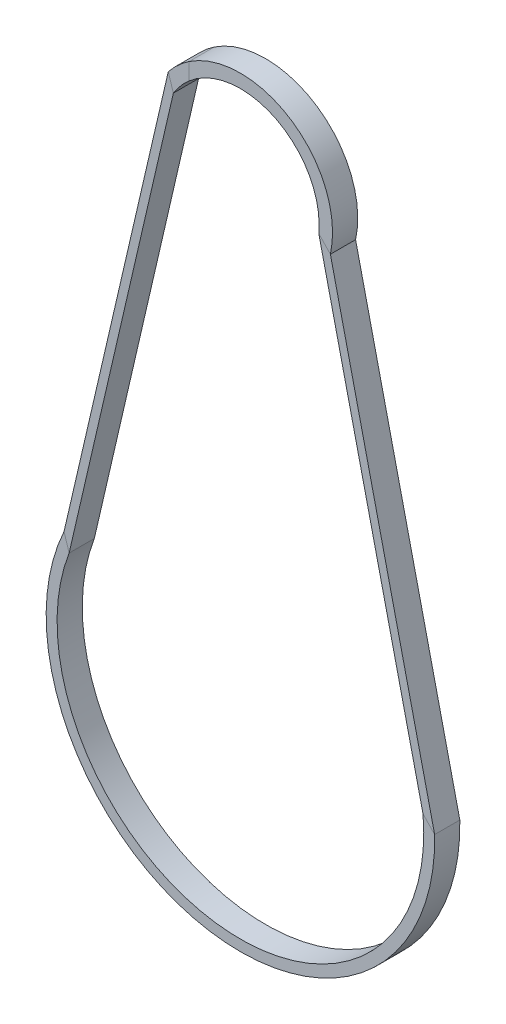
ISO-10303-21;
HEADER;
FILE_DESCRIPTION(('STEP AP214'),'2;1');
FILE_NAME('part.step','',(''),(''),'','','');
FILE_SCHEMA(('AUTOMOTIVE_DESIGN { 1 0 10303 214 1 1 1 1 }'));
ENDSEC;
DATA;
#1=APPLICATION_CONTEXT('core data for automotive mechanical design processes');
#2=APPLICATION_PROTOCOL_DEFINITION('international standard','automotive_design',2000,#1);
#3=PRODUCT_CONTEXT('',#1,'mechanical');
#4=PRODUCT('Part','Part','',(#3));
#5=PRODUCT_RELATED_PRODUCT_CATEGORY('part','',(#4));
#6=PRODUCT_DEFINITION_FORMATION('','',#4);
#7=PRODUCT_DEFINITION_CONTEXT('part definition',#1,'design');
#8=PRODUCT_DEFINITION('design','',#6,#7);
#9=PRODUCT_DEFINITION_SHAPE('','',#8);
#10=(LENGTH_UNIT() NAMED_UNIT(*) SI_UNIT(.MILLI.,.METRE.));
#11=(NAMED_UNIT(*) PLANE_ANGLE_UNIT() SI_UNIT($,.RADIAN.));
#12=(NAMED_UNIT(*) SI_UNIT($,.STERADIAN.) SOLID_ANGLE_UNIT());
#13=UNCERTAINTY_MEASURE_WITH_UNIT(LENGTH_MEASURE(1.E-05),#10,'distance_accuracy_value','');
#14=(GEOMETRIC_REPRESENTATION_CONTEXT(3) GLOBAL_UNCERTAINTY_ASSIGNED_CONTEXT((#13)) GLOBAL_UNIT_ASSIGNED_CONTEXT((#10,
#11,#12)) REPRESENTATION_CONTEXT('',''));
#15=CARTESIAN_POINT('',(0.,0.,0.));
#16=DIRECTION('',(0.,0.,1.));
#17=DIRECTION('',(1.,0.,0.));
#18=AXIS2_PLACEMENT_3D('',#15,#16,#17);
#19=CARTESIAN_POINT('',(3.46090677559141,6.54532965485075,0.));
#20=DIRECTION('',(0.,0.,-1.));
#21=DIRECTION('',(-1.,0.,0.));
#22=AXIS2_PLACEMENT_3D('',#19,#20,#21);
#23=CYLINDRICAL_SURFACE('',#22,9.37411083089852);
#24=CARTESIAN_POINT('',(3.46090677559141,6.54532965485075,0.));
#25=DIRECTION('',(0.,0.,-1.));
#26=DIRECTION('',(-0.851505632173699,0.52434545709529,0.));
#27=AXIS2_PLACEMENT_3D('',#24,#25,#26);
#28=CIRCLE('',#27,9.37411083089852);
#29=CARTESIAN_POINT('',(-4.52120139353916,11.4606020833402,0.));
#30=VERTEX_POINT('',#29);
#31=CARTESIAN_POINT('',(-2.65,13.6538296548507,0.));
#32=VERTEX_POINT('',#31);
#33=EDGE_CURVE('E11',#30,#32,#28,.T.);
#34=ORIENTED_EDGE('',*,*,#33,.F.);
#35=DIRECTION('',(0.,0.,-1.));
#36=VECTOR('',#35,1.);
#37=CARTESIAN_POINT('',(-4.52120139353916,11.4606020833402,0.));
#38=LINE('',#37,#36);
#39=CARTESIAN_POINT('',(-4.52120139353916,11.4606020833402,-3.));
#40=VERTEX_POINT('',#39);
#41=EDGE_CURVE('E36',#30,#40,#38,.T.);
#42=ORIENTED_EDGE('',*,*,#41,.T.);
#43=CARTESIAN_POINT('',(3.46090677559141,6.54532965485075,-3.));
#44=DIRECTION('',(0.,0.,-1.));
#45=DIRECTION('',(-0.851505632173699,0.52434545709529,0.));
#46=AXIS2_PLACEMENT_3D('',#43,#44,#45);
#47=CIRCLE('',#46,9.37411083089852);
#48=CARTESIAN_POINT('',(-2.65,13.6538296548507,-3.));
#49=VERTEX_POINT('',#48);
#50=EDGE_CURVE('E124',#40,#49,#47,.T.);
#51=ORIENTED_EDGE('',*,*,#50,.T.);
#52=DIRECTION('',(0.,0.,-1.));
#53=VECTOR('',#52,1.);
#54=CARTESIAN_POINT('',(-2.65,13.6538296548507,0.));
#55=LINE('',#54,#53);
#56=EDGE_CURVE('E127',#32,#49,#55,.T.);
#57=ORIENTED_EDGE('',*,*,#56,.F.);
#58=EDGE_LOOP('',(#34,#42,#51,#57));
#59=FACE_BOUND('',#58,.T.);
#60=ADVANCED_FACE('F33',(#59),#23,.F.);
#61=CARTESIAN_POINT('',(-4.52120139353916,11.4606020833401,0.));
#62=DIRECTION('',(0.,0.,1.));
#63=DIRECTION('',(1.,0.,0.));
#64=AXIS2_PLACEMENT_3D('',#61,#62,#63);
#65=PLANE('',#64);
#66=CARTESIAN_POINT('',(3.46090677559141,6.54532965485075,0.));
#67=DIRECTION('',(0.,0.,-1.));
#68=DIRECTION('',(-0.78314174114479,0.621843238506865,0.));
#69=AXIS2_PLACEMENT_3D('',#66,#67,#68);
#70=CIRCLE('',#69,10.9684982504429);
#71=CARTESIAN_POINT('',(-5.12898204200404,13.3660161284631,0.));
#72=VERTEX_POINT('',#71);
#73=CARTESIAN_POINT('',(-2.65,15.6538296548507,0.));
#74=VERTEX_POINT('',#73);
#75=EDGE_CURVE('E41',#72,#74,#70,.T.);
#76=ORIENTED_EDGE('',*,*,#75,.F.);
#77=DIRECTION('',(0.303890324232439,-0.95270702256145,0.));
#78=VECTOR('',#77,1.);
#79=CARTESIAN_POINT('',(-4.52120139353916,11.4606020833402,0.));
#80=LINE('',#79,#78);
#81=EDGE_CURVE('E214',#72,#30,#80,.T.);
#82=ORIENTED_EDGE('',*,*,#81,.T.);
#83=ORIENTED_EDGE('',*,*,#33,.T.);
#84=DIRECTION('',(0.,-1.,0.));
#85=VECTOR('',#84,1.);
#86=CARTESIAN_POINT('',(-2.65,13.6538296548507,0.));
#87=LINE('',#86,#85);
#88=EDGE_CURVE('E152',#74,#32,#87,.T.);
#89=ORIENTED_EDGE('',*,*,#88,.F.);
#90=EDGE_LOOP('',(#76,#82,#83,#89));
#91=FACE_BOUND('',#90,.T.);
#92=ADVANCED_FACE('F261',(#91),#65,.T.);
#93=CARTESIAN_POINT('',(3.46090677559141,6.54532965485075,0.));
#94=DIRECTION('',(0.,0.,-1.));
#95=DIRECTION('',(-1.,0.,0.));
#96=AXIS2_PLACEMENT_3D('',#93,#94,#95);
#97=CYLINDRICAL_SURFACE('',#96,10.9684982504429);
#98=CARTESIAN_POINT('',(3.46090677559141,6.54532965485075,-3.));
#99=DIRECTION('',(0.,0.,-1.));
#100=DIRECTION('',(-0.78314174114479,0.621843238506865,0.));
#101=AXIS2_PLACEMENT_3D('',#98,#99,#100);
#102=CIRCLE('',#101,10.9684982504429);
#103=CARTESIAN_POINT('',(-5.12898204200404,13.3660161284631,-3.));
#104=VERTEX_POINT('',#103);
#105=CARTESIAN_POINT('',(-2.65,15.6538296548507,-3.));
#106=VERTEX_POINT('',#105);
#107=EDGE_CURVE('E133',#104,#106,#102,.T.);
#108=ORIENTED_EDGE('',*,*,#107,.F.);
#109=DIRECTION('',(0.,0.,1.));
#110=VECTOR('',#109,1.);
#111=CARTESIAN_POINT('',(-5.12898204200404,13.3660161284631,0.));
#112=LINE('',#111,#110);
#113=EDGE_CURVE('E189',#104,#72,#112,.T.);
#114=ORIENTED_EDGE('',*,*,#113,.T.);
#115=ORIENTED_EDGE('',*,*,#75,.T.);
#116=DIRECTION('',(0.,0.,1.));
#117=VECTOR('',#116,1.);
#118=CARTESIAN_POINT('',(-2.65,15.6538296548507,0.));
#119=LINE('',#118,#117);
#120=EDGE_CURVE('E156',#106,#74,#119,.T.);
#121=ORIENTED_EDGE('',*,*,#120,.F.);
#122=EDGE_LOOP('',(#108,#114,#115,#121));
#123=FACE_BOUND('',#122,.T.);
#124=ADVANCED_FACE('F265',(#123),#97,.T.);
#125=CARTESIAN_POINT('',(-16.9317153945077,-42.1673736086449,0.));
#126=DIRECTION('',(0.974252384579708,-0.225460176396525,0.));
#127=DIRECTION('',(0.225460176396525,0.974252384579708,0.));
#128=AXIS2_PLACEMENT_3D('',#125,#126,#127);
#129=PLANE('',#128);
#130=ORIENTED_EDGE('',*,*,#41,.F.);
#131=DIRECTION('',(0.225460176396525,0.974252384579709,0.));
#132=VECTOR('',#131,1.);
#133=CARTESIAN_POINT('',(-16.9317153945077,-42.1673736086449,0.));
#134=LINE('',#133,#132);
#135=CARTESIAN_POINT('',(-16.9317153945077,-42.167373608645,0.));
#136=VERTEX_POINT('',#135);
#137=EDGE_CURVE('E228',#136,#30,#134,.T.);
#138=ORIENTED_EDGE('',*,*,#137,.F.);
#139=DIRECTION('',(0.,0.,-1.));
#140=VECTOR('',#139,1.);
#141=CARTESIAN_POINT('',(-16.9317153945077,-42.1673736086449,0.));
#142=LINE('',#141,#140);
#143=CARTESIAN_POINT('',(-16.9317153945077,-42.167373608645,-3.));
#144=VERTEX_POINT('',#143);
#145=EDGE_CURVE('E192',#136,#144,#142,.T.);
#146=ORIENTED_EDGE('',*,*,#145,.T.);
#147=DIRECTION('',(0.225460176396525,0.974252384579709,0.));
#148=VECTOR('',#147,1.);
#149=CARTESIAN_POINT('',(-16.9317153945077,-42.1673736086449,-3.));
#150=LINE('',#149,#148);
#151=EDGE_CURVE('E186',#144,#40,#150,.T.);
#152=ORIENTED_EDGE('',*,*,#151,.T.);
#153=EDGE_LOOP('',(#130,#138,#146,#152));
#154=FACE_BOUND('',#153,.T.);
#155=ADVANCED_FACE('F237',(#154),#129,.T.);
#156=CARTESIAN_POINT('',(-16.9317153945077,-42.1673736086449,0.));
#157=DIRECTION('',(0.,0.,1.));
#158=DIRECTION('',(1.,0.,0.));
#159=AXIS2_PLACEMENT_3D('',#156,#157,#158);
#160=PLANE('',#159);
#161=ORIENTED_EDGE('',*,*,#137,.T.);
#162=ORIENTED_EDGE('',*,*,#81,.F.);
#163=DIRECTION('',(0.225460176396525,0.974252384579709,0.));
#164=VECTOR('',#163,1.);
#165=CARTESIAN_POINT('',(-17.5394960429726,-40.261959563522,0.));
#166=LINE('',#165,#164);
#167=CARTESIAN_POINT('',(-17.5394960429726,-40.261959563522,0.));
#168=VERTEX_POINT('',#167);
#169=EDGE_CURVE('E211',#168,#72,#166,.T.);
#170=ORIENTED_EDGE('',*,*,#169,.F.);
#171=DIRECTION('',(0.30389032423244,-0.95270702256145,0.));
#172=VECTOR('',#171,1.);
#173=CARTESIAN_POINT('',(-16.9317153945077,-42.1673736086449,0.));
#174=LINE('',#173,#172);
#175=EDGE_CURVE('E207',#168,#136,#174,.T.);
#176=ORIENTED_EDGE('',*,*,#175,.T.);
#177=EDGE_LOOP('',(#161,#162,#170,#176));
#178=FACE_BOUND('',#177,.T.);
#179=ADVANCED_FACE('F274',(#178),#160,.T.);
#180=CARTESIAN_POINT('',(-17.5394960429726,-40.261959563522,0.));
#181=DIRECTION('',(-0.974252384579708,0.225460176396525,0.));
#182=DIRECTION('',(-0.225460176396525,-0.974252384579708,0.));
#183=AXIS2_PLACEMENT_3D('',#180,#181,#182);
#184=PLANE('',#183);
#185=ORIENTED_EDGE('',*,*,#169,.T.);
#186=ORIENTED_EDGE('',*,*,#113,.F.);
#187=DIRECTION('',(0.225460176396525,0.974252384579709,0.));
#188=VECTOR('',#187,1.);
#189=CARTESIAN_POINT('',(-17.5394960429726,-40.261959563522,-3.));
#190=LINE('',#189,#188);
#191=CARTESIAN_POINT('',(-17.5394960429726,-40.261959563522,-3.));
#192=VERTEX_POINT('',#191);
#193=EDGE_CURVE('E185',#192,#104,#190,.T.);
#194=ORIENTED_EDGE('',*,*,#193,.F.);
#195=DIRECTION('',(0.,0.,1.));
#196=VECTOR('',#195,1.);
#197=CARTESIAN_POINT('',(-17.5394960429726,-40.261959563522,0.));
#198=LINE('',#197,#196);
#199=EDGE_CURVE('E178',#192,#168,#198,.T.);
#200=ORIENTED_EDGE('',*,*,#199,.T.);
#201=EDGE_LOOP('',(#185,#186,#194,#200));
#202=FACE_BOUND('',#201,.T.);
#203=ADVANCED_FACE('F245',(#202),#184,.T.);
#204=CARTESIAN_POINT('',(-16.9317153945077,-42.1673736086449,-3.));
#205=DIRECTION('',(0.,0.,-1.));
#206=DIRECTION('',(-1.,0.,0.));
#207=AXIS2_PLACEMENT_3D('',#204,#205,#206);
#208=PLANE('',#207);
#209=ORIENTED_EDGE('',*,*,#193,.T.);
#210=DIRECTION('',(-0.303890324232439,0.95270702256145,0.));
#211=VECTOR('',#210,1.);
#212=CARTESIAN_POINT('',(-4.52120139353916,11.4606020833402,-3.));
#213=LINE('',#212,#211);
#214=EDGE_CURVE('E183',#40,#104,#213,.T.);
#215=ORIENTED_EDGE('',*,*,#214,.F.);
#216=ORIENTED_EDGE('',*,*,#151,.F.);
#217=DIRECTION('',(-0.30389032423244,0.95270702256145,0.));
#218=VECTOR('',#217,1.);
#219=CARTESIAN_POINT('',(-16.9317153945077,-42.1673736086449,-3.));
#220=LINE('',#219,#218);
#221=EDGE_CURVE('E175',#144,#192,#220,.T.);
#222=ORIENTED_EDGE('',*,*,#221,.T.);
#223=EDGE_LOOP('',(#209,#215,#216,#222));
#224=FACE_BOUND('',#223,.T.);
#225=ADVANCED_FACE('F242',(#224),#208,.T.);
#226=CARTESIAN_POINT('',(3.46090677559147,-49.9546704941614,0.));
#227=DIRECTION('',(0.,0.,-1.));
#228=DIRECTION('',(-1.,0.,0.));
#229=AXIS2_PLACEMENT_3D('',#226,#227,#228);
#230=CYLINDRICAL_SURFACE('',#229,21.8289035857415);
#231=ORIENTED_EDGE('',*,*,#145,.F.);
#232=CARTESIAN_POINT('',(3.46090677559147,-49.9546704941614,0.));
#233=DIRECTION('',(0.,0.,-1.));
#234=DIRECTION('',(0.995948048785206,0.0899304404578343,0.));
#235=AXIS2_PLACEMENT_3D('',#232,#233,#234);
#236=CIRCLE('',#235,21.8289035857415);
#237=CARTESIAN_POINT('',(25.2013607089311,-47.9915875799841,0.));
#238=VERTEX_POINT('',#237);
#239=EDGE_CURVE('E82',#238,#136,#236,.T.);
#240=ORIENTED_EDGE('',*,*,#239,.F.);
#241=DIRECTION('',(0.,0.,-1.));
#242=VECTOR('',#241,1.);
#243=CARTESIAN_POINT('',(25.2013607089311,-47.9915875799841,0.));
#244=LINE('',#243,#242);
#245=CARTESIAN_POINT('',(25.2013607089311,-47.9915875799841,-3.));
#246=VERTEX_POINT('',#245);
#247=EDGE_CURVE('E182',#238,#246,#244,.T.);
#248=ORIENTED_EDGE('',*,*,#247,.T.);
#249=CARTESIAN_POINT('',(3.46090677559147,-49.9546704941614,-3.));
#250=DIRECTION('',(0.,0.,-1.));
#251=DIRECTION('',(0.995948048785206,0.0899304404578343,0.));
#252=AXIS2_PLACEMENT_3D('',#249,#250,#251);
#253=CIRCLE('',#252,21.8289035857415);
#254=EDGE_CURVE('E180',#246,#144,#253,.T.);
#255=ORIENTED_EDGE('',*,*,#254,.T.);
#256=EDGE_LOOP('',(#231,#240,#248,#255));
#257=FACE_BOUND('',#256,.T.);
#258=ADVANCED_FACE('F256',(#257),#230,.F.);
#259=CARTESIAN_POINT('',(25.2013607089311,-47.9915875799841,0.));
#260=DIRECTION('',(0.,0.,1.));
#261=DIRECTION('',(1.,0.,0.));
#262=AXIS2_PLACEMENT_3D('',#259,#260,#261);
#263=PLANE('',#262);
#264=ORIENTED_EDGE('',*,*,#239,.T.);
#265=ORIENTED_EDGE('',*,*,#175,.F.);
#266=CARTESIAN_POINT('',(3.46090677559147,-49.9546704941614,0.));
#267=DIRECTION('',(0.,0.,-1.));
#268=DIRECTION('',(0.999748808077452,0.0224125131949615,0.));
#269=AXIS2_PLACEMENT_3D('',#266,#267,#268);
#270=CIRCLE('',#269,23.129322595504);
#271=CARTESIAN_POINT('',(26.5844194720854,-49.4362842462992,0.));
#272=VERTEX_POINT('',#271);
#273=EDGE_CURVE('E92',#272,#168,#270,.T.);
#274=ORIENTED_EDGE('',*,*,#273,.F.);
#275=DIRECTION('',(-0.691529381577185,0.72234833315754,0.));
#276=VECTOR('',#275,1.);
#277=CARTESIAN_POINT('',(25.2013607089311,-47.9915875799841,0.));
#278=LINE('',#277,#276);
#279=EDGE_CURVE('E204',#272,#238,#278,.T.);
#280=ORIENTED_EDGE('',*,*,#279,.T.);
#281=EDGE_LOOP('',(#264,#265,#274,#280));
#282=FACE_BOUND('',#281,.T.);
#283=ADVANCED_FACE('F248',(#282),#263,.T.);
#284=CARTESIAN_POINT('',(3.46090677559147,-49.9546704941614,0.));
#285=DIRECTION('',(0.,0.,-1.));
#286=DIRECTION('',(-1.,0.,0.));
#287=AXIS2_PLACEMENT_3D('',#284,#285,#286);
#288=CYLINDRICAL_SURFACE('',#287,23.129322595504);
#289=ORIENTED_EDGE('',*,*,#273,.T.);
#290=ORIENTED_EDGE('',*,*,#199,.F.);
#291=CARTESIAN_POINT('',(3.46090677559147,-49.9546704941614,-3.));
#292=DIRECTION('',(0.,0.,-1.));
#293=DIRECTION('',(0.999748808077452,0.0224125131949615,0.));
#294=AXIS2_PLACEMENT_3D('',#291,#292,#293);
#295=CIRCLE('',#294,23.129322595504);
#296=CARTESIAN_POINT('',(26.5844194720854,-49.4362842462992,-3.));
#297=VERTEX_POINT('',#296);
#298=EDGE_CURVE('E100',#297,#192,#295,.T.);
#299=ORIENTED_EDGE('',*,*,#298,.F.);
#300=DIRECTION('',(0.,0.,1.));
#301=VECTOR('',#300,1.);
#302=CARTESIAN_POINT('',(26.5844194720854,-49.4362842462992,0.));
#303=LINE('',#302,#301);
#304=EDGE_CURVE('E171',#297,#272,#303,.T.);
#305=ORIENTED_EDGE('',*,*,#304,.T.);
#306=EDGE_LOOP('',(#289,#290,#299,#305));
#307=FACE_BOUND('',#306,.T.);
#308=ADVANCED_FACE('F246',(#307),#288,.T.);
#309=CARTESIAN_POINT('',(25.2013607089311,-47.9915875799841,-3.));
#310=DIRECTION('',(0.,0.,-1.));
#311=DIRECTION('',(-1.,0.,0.));
#312=AXIS2_PLACEMENT_3D('',#309,#310,#311);
#313=PLANE('',#312);
#314=ORIENTED_EDGE('',*,*,#298,.T.);
#315=ORIENTED_EDGE('',*,*,#221,.F.);
#316=ORIENTED_EDGE('',*,*,#254,.F.);
#317=DIRECTION('',(0.691529381577185,-0.72234833315754,0.));
#318=VECTOR('',#317,1.);
#319=CARTESIAN_POINT('',(25.2013607089311,-47.9915875799841,-3.));
#320=LINE('',#319,#318);
#321=EDGE_CURVE('E165',#246,#297,#320,.T.);
#322=ORIENTED_EDGE('',*,*,#321,.T.);
#323=EDGE_LOOP('',(#314,#315,#316,#322));
#324=FACE_BOUND('',#323,.T.);
#325=ADVANCED_FACE('F240',(#324),#313,.T.);
#326=CARTESIAN_POINT('',(12.7908467079624,5.63638811200093,0.));
#327=DIRECTION('',(-0.974252384579708,-0.225460176396526,0.));
#328=DIRECTION('',(0.225460176396526,-0.974252384579708,0.));
#329=AXIS2_PLACEMENT_3D('',#326,#327,#328);
#330=PLANE('',#329);
#331=ORIENTED_EDGE('',*,*,#247,.F.);
#332=DIRECTION('',(0.225460176396526,-0.974252384579708,0.));
#333=VECTOR('',#332,1.);
#334=CARTESIAN_POINT('',(12.7908467079624,5.63638811200093,0.));
#335=LINE('',#334,#333);
#336=CARTESIAN_POINT('',(12.7908467079624,5.63638811200093,0.));
#337=VERTEX_POINT('',#336);
#338=EDGE_CURVE('E221',#337,#238,#335,.T.);
#339=ORIENTED_EDGE('',*,*,#338,.F.);
#340=DIRECTION('',(0.,0.,-1.));
#341=VECTOR('',#340,1.);
#342=CARTESIAN_POINT('',(12.7908467079624,5.63638811200092,0.));
#343=LINE('',#342,#341);
#344=CARTESIAN_POINT('',(12.7908467079624,5.63638811200093,-3.));
#345=VERTEX_POINT('',#344);
#346=EDGE_CURVE('E174',#337,#345,#343,.T.);
#347=ORIENTED_EDGE('',*,*,#346,.T.);
#348=DIRECTION('',(0.225460176396526,-0.974252384579708,0.));
#349=VECTOR('',#348,1.);
#350=CARTESIAN_POINT('',(12.7908467079624,5.63638811200093,-3.));
#351=LINE('',#350,#349);
#352=EDGE_CURVE('E168',#345,#246,#351,.T.);
#353=ORIENTED_EDGE('',*,*,#352,.T.);
#354=EDGE_LOOP('',(#331,#339,#347,#353));
#355=FACE_BOUND('',#354,.T.);
#356=ADVANCED_FACE('F254',(#355),#330,.T.);
#357=CARTESIAN_POINT('',(12.7908467079624,5.63638811200093,0.));
#358=DIRECTION('',(0.,0.,1.));
#359=DIRECTION('',(1.,0.,0.));
#360=AXIS2_PLACEMENT_3D('',#357,#358,#359);
#361=PLANE('',#360);
#362=ORIENTED_EDGE('',*,*,#338,.T.);
#363=ORIENTED_EDGE('',*,*,#279,.F.);
#364=DIRECTION('',(0.225460176396526,-0.974252384579708,0.));
#365=VECTOR('',#364,1.);
#366=CARTESIAN_POINT('',(14.1739054711168,4.19169144568585,0.));
#367=LINE('',#366,#365);
#368=CARTESIAN_POINT('',(14.1739054711168,4.19169144568585,0.));
#369=VERTEX_POINT('',#368);
#370=EDGE_CURVE('E201',#369,#272,#367,.T.);
#371=ORIENTED_EDGE('',*,*,#370,.F.);
#372=DIRECTION('',(-0.691529381577184,0.72234833315754,0.));
#373=VECTOR('',#372,1.);
#374=CARTESIAN_POINT('',(12.7908467079624,5.63638811200092,0.));
#375=LINE('',#374,#373);
#376=EDGE_CURVE('E199',#369,#337,#375,.T.);
#377=ORIENTED_EDGE('',*,*,#376,.T.);
#378=EDGE_LOOP('',(#362,#363,#371,#377));
#379=FACE_BOUND('',#378,.T.);
#380=ADVANCED_FACE('F281',(#379),#361,.T.);
#381=CARTESIAN_POINT('',(14.1739054711168,4.19169144568585,0.));
#382=DIRECTION('',(0.974252384579708,0.225460176396526,0.));
#383=DIRECTION('',(-0.225460176396526,0.974252384579708,0.));
#384=AXIS2_PLACEMENT_3D('',#381,#382,#383);
#385=PLANE('',#384);
#386=ORIENTED_EDGE('',*,*,#370,.T.);
#387=ORIENTED_EDGE('',*,*,#304,.F.);
#388=DIRECTION('',(0.225460176396526,-0.974252384579708,0.));
#389=VECTOR('',#388,1.);
#390=CARTESIAN_POINT('',(14.1739054711168,4.19169144568585,-3.));
#391=LINE('',#390,#389);
#392=CARTESIAN_POINT('',(14.1739054711168,4.19169144568585,-3.));
#393=VERTEX_POINT('',#392);
#394=EDGE_CURVE('E167',#393,#297,#391,.T.);
#395=ORIENTED_EDGE('',*,*,#394,.F.);
#396=DIRECTION('',(0.,0.,1.));
#397=VECTOR('',#396,1.);
#398=CARTESIAN_POINT('',(14.1739054711168,4.19169144568584,0.));
#399=LINE('',#398,#397);
#400=EDGE_CURVE('E163',#393,#369,#399,.T.);
#401=ORIENTED_EDGE('',*,*,#400,.T.);
#402=EDGE_LOOP('',(#386,#387,#395,#401));
#403=FACE_BOUND('',#402,.T.);
#404=ADVANCED_FACE('F301',(#403),#385,.T.);
#405=CARTESIAN_POINT('',(12.7908467079624,5.63638811200093,-3.));
#406=DIRECTION('',(0.,0.,-1.));
#407=DIRECTION('',(-1.,0.,0.));
#408=AXIS2_PLACEMENT_3D('',#405,#406,#407);
#409=PLANE('',#408);
#410=ORIENTED_EDGE('',*,*,#394,.T.);
#411=ORIENTED_EDGE('',*,*,#321,.F.);
#412=ORIENTED_EDGE('',*,*,#352,.F.);
#413=DIRECTION('',(0.691529381577184,-0.72234833315754,0.));
#414=VECTOR('',#413,1.);
#415=CARTESIAN_POINT('',(12.7908467079624,5.63638811200092,-3.));
#416=LINE('',#415,#414);
#417=EDGE_CURVE('E144',#345,#393,#416,.T.);
#418=ORIENTED_EDGE('',*,*,#417,.T.);
#419=EDGE_LOOP('',(#410,#411,#412,#418));
#420=FACE_BOUND('',#419,.T.);
#421=ADVANCED_FACE('F278',(#420),#409,.T.);
#422=CARTESIAN_POINT('',(3.46090677559141,6.54532965485075,0.));
#423=DIRECTION('',(0.,0.,-1.));
#424=DIRECTION('',(-1.,0.,0.));
#425=AXIS2_PLACEMENT_3D('',#422,#423,#424);
#426=CYLINDRICAL_SURFACE('',#425,9.37411083089852);
#427=ORIENTED_EDGE('',*,*,#346,.F.);
#428=CARTESIAN_POINT('',(3.46090677559141,6.54532965485075,0.));
#429=DIRECTION('',(0.,0.,-1.));
#430=DIRECTION('',(-0.651891884556017,0.758311921869889,0.));
#431=AXIS2_PLACEMENT_3D('',#428,#429,#430);
#432=CIRCLE('',#431,9.37411083089852);
#433=EDGE_CURVE('E151',#32,#337,#432,.T.);
#434=ORIENTED_EDGE('',*,*,#433,.F.);
#435=ORIENTED_EDGE('',*,*,#56,.T.);
#436=CARTESIAN_POINT('',(3.46090677559141,6.54532965485075,-3.));
#437=DIRECTION('',(0.,0.,-1.));
#438=DIRECTION('',(-0.651891884556017,0.758311921869889,0.));
#439=AXIS2_PLACEMENT_3D('',#436,#437,#438);
#440=CIRCLE('',#439,9.37411083089852);
#441=EDGE_CURVE('E139',#49,#345,#440,.T.);
#442=ORIENTED_EDGE('',*,*,#441,.T.);
#443=EDGE_LOOP('',(#427,#434,#435,#442));
#444=FACE_BOUND('',#443,.T.);
#445=ADVANCED_FACE('F149',(#444),#426,.F.);
#446=CARTESIAN_POINT('',(-2.65,13.6538296548507,0.));
#447=DIRECTION('',(0.,0.,1.));
#448=DIRECTION('',(1.,0.,0.));
#449=AXIS2_PLACEMENT_3D('',#446,#447,#448);
#450=PLANE('',#449);
#451=ORIENTED_EDGE('',*,*,#433,.T.);
#452=ORIENTED_EDGE('',*,*,#376,.F.);
#453=CARTESIAN_POINT('',(3.46090677559141,6.54532965485075,0.));
#454=DIRECTION('',(0.,0.,-1.));
#455=DIRECTION('',(-0.557132493078043,0.830423617894291,0.));
#456=AXIS2_PLACEMENT_3D('',#453,#454,#455);
#457=CIRCLE('',#456,10.9684982504429);
#458=EDGE_CURVE('E196',#74,#369,#457,.T.);
#459=ORIENTED_EDGE('',*,*,#458,.F.);
#460=ORIENTED_EDGE('',*,*,#88,.T.);
#461=EDGE_LOOP('',(#451,#452,#459,#460));
#462=FACE_BOUND('',#461,.T.);
#463=ADVANCED_FACE('F277',(#462),#450,.T.);
#464=CARTESIAN_POINT('',(3.46090677559141,6.54532965485075,0.));
#465=DIRECTION('',(0.,0.,-1.));
#466=DIRECTION('',(-1.,0.,0.));
#467=AXIS2_PLACEMENT_3D('',#464,#465,#466);
#468=CYLINDRICAL_SURFACE('',#467,10.9684982504429);
#469=ORIENTED_EDGE('',*,*,#458,.T.);
#470=ORIENTED_EDGE('',*,*,#400,.F.);
#471=CARTESIAN_POINT('',(3.46090677559141,6.54532965485075,-3.));
#472=DIRECTION('',(0.,0.,-1.));
#473=DIRECTION('',(-0.557132493078043,0.830423617894291,0.));
#474=AXIS2_PLACEMENT_3D('',#471,#472,#473);
#475=CIRCLE('',#474,10.9684982504429);
#476=EDGE_CURVE('E162',#106,#393,#475,.T.);
#477=ORIENTED_EDGE('',*,*,#476,.F.);
#478=ORIENTED_EDGE('',*,*,#120,.T.);
#479=EDGE_LOOP('',(#469,#470,#477,#478));
#480=FACE_BOUND('',#479,.T.);
#481=ADVANCED_FACE('F296',(#480),#468,.T.);
#482=CARTESIAN_POINT('',(-2.65,13.6538296548507,-3.));
#483=DIRECTION('',(0.,0.,-1.));
#484=DIRECTION('',(-1.,0.,0.));
#485=AXIS2_PLACEMENT_3D('',#482,#483,#484);
#486=PLANE('',#485);
#487=ORIENTED_EDGE('',*,*,#476,.T.);
#488=ORIENTED_EDGE('',*,*,#417,.F.);
#489=ORIENTED_EDGE('',*,*,#441,.F.);
#490=DIRECTION('',(0.,1.,0.));
#491=VECTOR('',#490,1.);
#492=CARTESIAN_POINT('',(-2.65,13.6538296548507,-3.));
#493=LINE('',#492,#491);
#494=EDGE_CURVE('E142',#49,#106,#493,.T.);
#495=ORIENTED_EDGE('',*,*,#494,.T.);
#496=EDGE_LOOP('',(#487,#488,#489,#495));
#497=FACE_BOUND('',#496,.T.);
#498=ADVANCED_FACE('F141',(#497),#486,.T.);
#499=CARTESIAN_POINT('',(-4.52120139353916,11.4606020833401,-3.));
#500=DIRECTION('',(0.,0.,-1.));
#501=DIRECTION('',(-1.,0.,0.));
#502=AXIS2_PLACEMENT_3D('',#499,#500,#501);
#503=PLANE('',#502);
#504=ORIENTED_EDGE('',*,*,#214,.T.);
#505=ORIENTED_EDGE('',*,*,#107,.T.);
#506=ORIENTED_EDGE('',*,*,#494,.F.);
#507=ORIENTED_EDGE('',*,*,#50,.F.);
#508=EDGE_LOOP('',(#504,#505,#506,#507));
#509=FACE_BOUND('',#508,.T.);
#510=ADVANCED_FACE('F154',(#509),#503,.T.);
#511=CLOSED_SHELL('',(#60,#92,#124,#155,#179,#203,#225,#258,#283,#308,#325,#356,#380,#404,#421,
#445,#463,#481,#498,#510));
#512=MANIFOLD_SOLID_BREP('B2',#511);
#513=ADVANCED_BREP_SHAPE_REPRESENTATION('',(#18,#512),#14);
#514=SHAPE_DEFINITION_REPRESENTATION(#9,#513);
ENDSEC;
END-ISO-10303-21;
